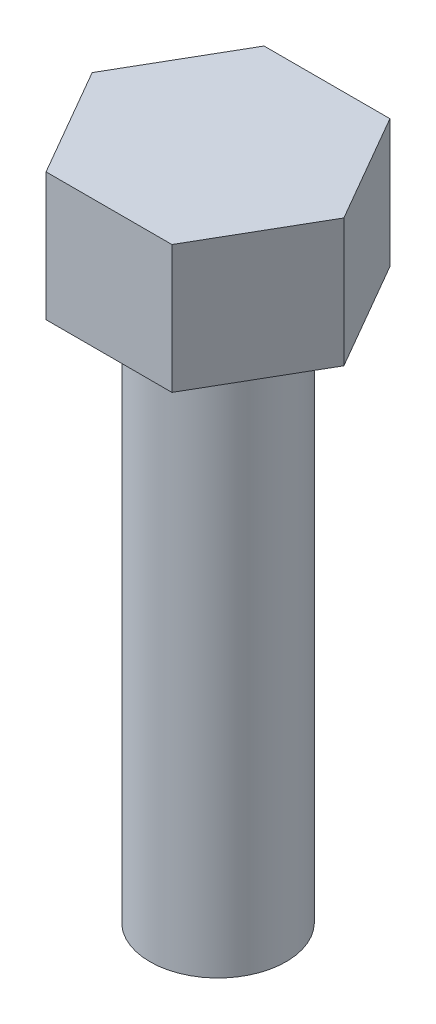
ISO-10303-21;
HEADER;
FILE_DESCRIPTION(('STEP AP214'),'2;1');
FILE_NAME('part.step','',(''),(''),'','','');
FILE_SCHEMA(('AUTOMOTIVE_DESIGN { 1 0 10303 214 1 1 1 1 }'));
ENDSEC;
DATA;
#1=APPLICATION_CONTEXT('core data for automotive mechanical design processes');
#2=APPLICATION_PROTOCOL_DEFINITION('international standard','automotive_design',2000,#1);
#3=PRODUCT_CONTEXT('',#1,'mechanical');
#4=PRODUCT('Part','Part','',(#3));
#5=PRODUCT_RELATED_PRODUCT_CATEGORY('part','',(#4));
#6=PRODUCT_DEFINITION_FORMATION('','',#4);
#7=PRODUCT_DEFINITION_CONTEXT('part definition',#1,'design');
#8=PRODUCT_DEFINITION('design','',#6,#7);
#9=PRODUCT_DEFINITION_SHAPE('','',#8);
#10=(LENGTH_UNIT() NAMED_UNIT(*) SI_UNIT(.MILLI.,.METRE.));
#11=(NAMED_UNIT(*) PLANE_ANGLE_UNIT() SI_UNIT($,.RADIAN.));
#12=(NAMED_UNIT(*) SI_UNIT($,.STERADIAN.) SOLID_ANGLE_UNIT());
#13=UNCERTAINTY_MEASURE_WITH_UNIT(LENGTH_MEASURE(1.E-05),#10,'distance_accuracy_value','');
#14=(GEOMETRIC_REPRESENTATION_CONTEXT(3) GLOBAL_UNCERTAINTY_ASSIGNED_CONTEXT((#13)) GLOBAL_UNIT_ASSIGNED_CONTEXT((#10,
#11,#12)) REPRESENTATION_CONTEXT('',''));
#15=CARTESIAN_POINT('',(0.,0.,0.));
#16=DIRECTION('',(0.,0.,1.));
#17=DIRECTION('',(1.,0.,0.));
#18=AXIS2_PLACEMENT_3D('',#15,#16,#17);
#19=CARTESIAN_POINT('',(2.30940107675853,4.7,4.00000000000007));
#20=DIRECTION('',(-0.866025403784438,0.,-0.500000000000001));
#21=DIRECTION('',(-0.500000000000001,0.,0.866025403784438));
#22=AXIS2_PLACEMENT_3D('',#19,#20,#21);
#23=PLANE('',#22);
#24=DIRECTION('',(0.500000000000001,0.,-0.866025403784438));
#25=VECTOR('',#24,1.);
#26=CARTESIAN_POINT('',(2.30940107675853,0.,4.00000000000007));
#27=LINE('',#26,#25);
#28=CARTESIAN_POINT('',(2.30940107675853,0.,4.00000000000007));
#29=VERTEX_POINT('',#28);
#30=CARTESIAN_POINT('',(4.61880215351705,0.,0.));
#31=VERTEX_POINT('',#30);
#32=EDGE_CURVE('E117',#29,#31,#27,.T.);
#33=ORIENTED_EDGE('',*,*,#32,.T.);
#34=DIRECTION('',(0.,-1.,0.));
#35=VECTOR('',#34,1.);
#36=CARTESIAN_POINT('',(4.61880215351705,4.7,0.));
#37=LINE('',#36,#35);
#38=CARTESIAN_POINT('',(4.61880215351705,4.7,0.));
#39=VERTEX_POINT('',#38);
#40=EDGE_CURVE('E11',#39,#31,#37,.T.);
#41=ORIENTED_EDGE('',*,*,#40,.F.);
#42=DIRECTION('',(0.500000000000001,0.,-0.866025403784438));
#43=VECTOR('',#42,1.);
#44=CARTESIAN_POINT('',(2.30940107675853,4.7,4.00000000000007));
#45=LINE('',#44,#43);
#46=CARTESIAN_POINT('',(2.30940107675853,4.7,4.00000000000007));
#47=VERTEX_POINT('',#46);
#48=EDGE_CURVE('E128',#47,#39,#45,.T.);
#49=ORIENTED_EDGE('',*,*,#48,.F.);
#50=DIRECTION('',(0.,-1.,0.));
#51=VECTOR('',#50,1.);
#52=CARTESIAN_POINT('',(2.30940107675853,4.7,4.00000000000007));
#53=LINE('',#52,#51);
#54=EDGE_CURVE('E113',#47,#29,#53,.T.);
#55=ORIENTED_EDGE('',*,*,#54,.T.);
#56=EDGE_LOOP('',(#33,#41,#49,#55));
#57=FACE_BOUND('',#56,.T.);
#58=ADVANCED_FACE('F33',(#57),#23,.F.);
#59=CARTESIAN_POINT('',(4.61880215351705,4.7,0.));
#60=DIRECTION('',(-0.866025403784437,0.,0.500000000000002));
#61=DIRECTION('',(0.500000000000002,0.,0.866025403784438));
#62=AXIS2_PLACEMENT_3D('',#59,#60,#61);
#63=PLANE('',#62);
#64=DIRECTION('',(-0.500000000000002,0.,-0.866025403784437));
#65=VECTOR('',#64,1.);
#66=CARTESIAN_POINT('',(4.61880215351705,0.,0.));
#67=LINE('',#66,#65);
#68=CARTESIAN_POINT('',(2.3094010767585,0.,-4.));
#69=VERTEX_POINT('',#68);
#70=EDGE_CURVE('E120',#31,#69,#67,.T.);
#71=ORIENTED_EDGE('',*,*,#70,.T.);
#72=DIRECTION('',(0.,-1.,0.));
#73=VECTOR('',#72,1.);
#74=CARTESIAN_POINT('',(2.3094010767585,4.7,-4.));
#75=LINE('',#74,#73);
#76=CARTESIAN_POINT('',(2.3094010767585,4.7,-4.));
#77=VERTEX_POINT('',#76);
#78=EDGE_CURVE('E41',#77,#69,#75,.T.);
#79=ORIENTED_EDGE('',*,*,#78,.F.);
#80=DIRECTION('',(-0.500000000000002,0.,-0.866025403784437));
#81=VECTOR('',#80,1.);
#82=CARTESIAN_POINT('',(4.61880215351705,4.7,0.));
#83=LINE('',#82,#81);
#84=EDGE_CURVE('E86',#39,#77,#83,.T.);
#85=ORIENTED_EDGE('',*,*,#84,.F.);
#86=ORIENTED_EDGE('',*,*,#40,.T.);
#87=EDGE_LOOP('',(#71,#79,#85,#86));
#88=FACE_BOUND('',#87,.T.);
#89=ADVANCED_FACE('F152',(#88),#63,.F.);
#90=CARTESIAN_POINT('',(2.3094010767585,4.7,-4.));
#91=DIRECTION('',(0.,0.,1.));
#92=DIRECTION('',(1.,0.,0.));
#93=AXIS2_PLACEMENT_3D('',#90,#91,#92);
#94=PLANE('',#93);
#95=DIRECTION('',(-1.,0.,0.));
#96=VECTOR('',#95,1.);
#97=CARTESIAN_POINT('',(2.3094010767585,0.,-4.));
#98=LINE('',#97,#96);
#99=CARTESIAN_POINT('',(-2.3094010767585,0.,-4.));
#100=VERTEX_POINT('',#99);
#101=EDGE_CURVE('E123',#69,#100,#98,.T.);
#102=ORIENTED_EDGE('',*,*,#101,.T.);
#103=DIRECTION('',(0.,-1.,0.));
#104=VECTOR('',#103,1.);
#105=CARTESIAN_POINT('',(-2.3094010767585,4.7,-4.));
#106=LINE('',#105,#104);
#107=CARTESIAN_POINT('',(-2.3094010767585,4.7,-4.));
#108=VERTEX_POINT('',#107);
#109=EDGE_CURVE('E108',#108,#100,#106,.T.);
#110=ORIENTED_EDGE('',*,*,#109,.F.);
#111=DIRECTION('',(-1.,0.,0.));
#112=VECTOR('',#111,1.);
#113=CARTESIAN_POINT('',(2.3094010767585,4.7,-4.));
#114=LINE('',#113,#112);
#115=EDGE_CURVE('E99',#77,#108,#114,.T.);
#116=ORIENTED_EDGE('',*,*,#115,.F.);
#117=ORIENTED_EDGE('',*,*,#78,.T.);
#118=EDGE_LOOP('',(#102,#110,#116,#117));
#119=FACE_BOUND('',#118,.T.);
#120=ADVANCED_FACE('F134',(#119),#94,.F.);
#121=CARTESIAN_POINT('',(-2.3094010767585,4.7,-4.));
#122=DIRECTION('',(0.866025403784439,0.,0.5));
#123=DIRECTION('',(0.5,0.,-0.866025403784439));
#124=AXIS2_PLACEMENT_3D('',#121,#122,#123);
#125=PLANE('',#124);
#126=DIRECTION('',(-0.5,0.,0.866025403784438));
#127=VECTOR('',#126,1.);
#128=CARTESIAN_POINT('',(-2.3094010767585,0.,-4.));
#129=LINE('',#128,#127);
#130=CARTESIAN_POINT('',(-4.61880215351701,0.,0.));
#131=VERTEX_POINT('',#130);
#132=EDGE_CURVE('E107',#100,#131,#129,.T.);
#133=ORIENTED_EDGE('',*,*,#132,.T.);
#134=DIRECTION('',(0.,-1.,0.));
#135=VECTOR('',#134,1.);
#136=CARTESIAN_POINT('',(-4.61880215351701,4.7,0.));
#137=LINE('',#136,#135);
#138=CARTESIAN_POINT('',(-4.61880215351701,4.7,0.));
#139=VERTEX_POINT('',#138);
#140=EDGE_CURVE('E104',#139,#131,#137,.T.);
#141=ORIENTED_EDGE('',*,*,#140,.F.);
#142=DIRECTION('',(-0.5,0.,0.866025403784438));
#143=VECTOR('',#142,1.);
#144=CARTESIAN_POINT('',(-2.3094010767585,4.7,-4.));
#145=LINE('',#144,#143);
#146=EDGE_CURVE('E93',#108,#139,#145,.T.);
#147=ORIENTED_EDGE('',*,*,#146,.F.);
#148=ORIENTED_EDGE('',*,*,#109,.T.);
#149=EDGE_LOOP('',(#133,#141,#147,#148));
#150=FACE_BOUND('',#149,.T.);
#151=ADVANCED_FACE('F105',(#150),#125,.F.);
#152=CARTESIAN_POINT('',(-4.61880215351701,4.7,0.));
#153=DIRECTION('',(0.866025403784447,0.,-0.499999999999985));
#154=DIRECTION('',(-0.499999999999985,0.,-0.866025403784447));
#155=AXIS2_PLACEMENT_3D('',#152,#153,#154);
#156=PLANE('',#155);
#157=DIRECTION('',(0.499999999999985,0.,0.866025403784447));
#158=VECTOR('',#157,1.);
#159=CARTESIAN_POINT('',(-4.61880215351701,0.,0.));
#160=LINE('',#159,#158);
#161=CARTESIAN_POINT('',(-2.30940107675855,0.,4.00000000000007));
#162=VERTEX_POINT('',#161);
#163=EDGE_CURVE('E72',#131,#162,#160,.T.);
#164=ORIENTED_EDGE('',*,*,#163,.T.);
#165=DIRECTION('',(0.,-1.,0.));
#166=VECTOR('',#165,1.);
#167=CARTESIAN_POINT('',(-2.30940107675855,4.7,4.00000000000007));
#168=LINE('',#167,#166);
#169=CARTESIAN_POINT('',(-2.30940107675855,4.7,4.00000000000007));
#170=VERTEX_POINT('',#169);
#171=EDGE_CURVE('E109',#170,#162,#168,.T.);
#172=ORIENTED_EDGE('',*,*,#171,.F.);
#173=DIRECTION('',(0.499999999999985,0.,0.866025403784447));
#174=VECTOR('',#173,1.);
#175=CARTESIAN_POINT('',(-4.61880215351701,4.7,0.));
#176=LINE('',#175,#174);
#177=EDGE_CURVE('E97',#139,#170,#176,.T.);
#178=ORIENTED_EDGE('',*,*,#177,.F.);
#179=ORIENTED_EDGE('',*,*,#140,.T.);
#180=EDGE_LOOP('',(#164,#172,#178,#179));
#181=FACE_BOUND('',#180,.T.);
#182=ADVANCED_FACE('F111',(#181),#156,.F.);
#183=CARTESIAN_POINT('',(-2.30940107675855,4.7,4.00000000000007));
#184=DIRECTION('',(0.,0.,-1.));
#185=DIRECTION('',(-1.,0.,0.));
#186=AXIS2_PLACEMENT_3D('',#183,#184,#185);
#187=PLANE('',#186);
#188=DIRECTION('',(1.,0.,0.));
#189=VECTOR('',#188,1.);
#190=CARTESIAN_POINT('',(-2.30940107675855,0.,4.00000000000007));
#191=LINE('',#190,#189);
#192=EDGE_CURVE('E78',#162,#29,#191,.T.);
#193=ORIENTED_EDGE('',*,*,#192,.T.);
#194=ORIENTED_EDGE('',*,*,#54,.F.);
#195=DIRECTION('',(1.,0.,0.));
#196=VECTOR('',#195,1.);
#197=CARTESIAN_POINT('',(-2.30940107675855,4.7,4.00000000000007));
#198=LINE('',#197,#196);
#199=EDGE_CURVE('E49',#170,#47,#198,.T.);
#200=ORIENTED_EDGE('',*,*,#199,.F.);
#201=ORIENTED_EDGE('',*,*,#171,.T.);
#202=EDGE_LOOP('',(#193,#194,#200,#201));
#203=FACE_BOUND('',#202,.T.);
#204=ADVANCED_FACE('F141',(#203),#187,.F.);
#205=CARTESIAN_POINT('',(4.61880215351705,4.7,0.));
#206=DIRECTION('',(0.,1.,0.));
#207=DIRECTION('',(0.,0.,1.));
#208=AXIS2_PLACEMENT_3D('',#205,#206,#207);
#209=PLANE('',#208);
#210=ORIENTED_EDGE('',*,*,#48,.T.);
#211=ORIENTED_EDGE('',*,*,#84,.T.);
#212=ORIENTED_EDGE('',*,*,#115,.T.);
#213=ORIENTED_EDGE('',*,*,#146,.T.);
#214=ORIENTED_EDGE('',*,*,#177,.T.);
#215=ORIENTED_EDGE('',*,*,#199,.T.);
#216=EDGE_LOOP('',(#210,#211,#212,#213,#214,#215));
#217=FACE_BOUND('',#216,.T.);
#218=ADVANCED_FACE('F95',(#217),#209,.T.);
#219=CARTESIAN_POINT('',(4.61880215351705,0.,0.));
#220=DIRECTION('',(0.,1.,0.));
#221=DIRECTION('',(0.,0.,1.));
#222=AXIS2_PLACEMENT_3D('',#219,#220,#221);
#223=PLANE('',#222);
#224=CARTESIAN_POINT('',(0.,0.,0.));
#225=DIRECTION('',(0.,1.,0.));
#226=DIRECTION('',(0.,0.,1.));
#227=AXIS2_PLACEMENT_3D('',#224,#225,#226);
#228=CIRCLE('',#227,2.5);
#229=CARTESIAN_POINT('',(0.,0.,2.5));
#230=VERTEX_POINT('',#229);
#231=EDGE_CURVE('E214',#230,#230,#228,.T.);
#232=ORIENTED_EDGE('',*,*,#231,.T.);
#233=EDGE_LOOP('',(#232));
#234=FACE_BOUND('',#233,.T.);
#235=ORIENTED_EDGE('',*,*,#32,.F.);
#236=ORIENTED_EDGE('',*,*,#192,.F.);
#237=ORIENTED_EDGE('',*,*,#163,.F.);
#238=ORIENTED_EDGE('',*,*,#132,.F.);
#239=ORIENTED_EDGE('',*,*,#101,.F.);
#240=ORIENTED_EDGE('',*,*,#70,.F.);
#241=EDGE_LOOP('',(#235,#236,#237,#238,#239,#240));
#242=FACE_BOUND('',#241,.T.);
#243=ADVANCED_FACE('F137',(#234,#242),#223,.F.);
#244=CARTESIAN_POINT('',(0.,-20.,0.));
#245=DIRECTION('',(0.,1.,0.));
#246=DIRECTION('',(0.,0.,1.));
#247=AXIS2_PLACEMENT_3D('',#244,#245,#246);
#248=CYLINDRICAL_SURFACE('',#247,2.5);
#249=CARTESIAN_POINT('',(0.,-20.,0.));
#250=DIRECTION('',(0.,1.,0.));
#251=DIRECTION('',(0.,0.,1.));
#252=AXIS2_PLACEMENT_3D('',#249,#250,#251);
#253=CIRCLE('',#252,2.5);
#254=CARTESIAN_POINT('',(0.,-20.,2.5));
#255=VERTEX_POINT('',#254);
#256=EDGE_CURVE('E121',#255,#255,#253,.T.);
#257=ORIENTED_EDGE('',*,*,#256,.T.);
#258=EDGE_LOOP('',(#257));
#259=FACE_BOUND('',#258,.T.);
#260=ORIENTED_EDGE('',*,*,#231,.F.);
#261=EDGE_LOOP('',(#260));
#262=FACE_BOUND('',#261,.T.);
#263=ADVANCED_FACE('F189',(#259,#262),#248,.T.);
#264=CARTESIAN_POINT('',(0.,-20.,0.));
#265=DIRECTION('',(0.,1.,0.));
#266=DIRECTION('',(0.,0.,1.));
#267=AXIS2_PLACEMENT_3D('',#264,#265,#266);
#268=PLANE('',#267);
#269=ORIENTED_EDGE('',*,*,#256,.F.);
#270=EDGE_LOOP('',(#269));
#271=FACE_BOUND('',#270,.T.);
#272=ADVANCED_FACE('F198',(#271),#268,.F.);
#273=CLOSED_SHELL('',(#58,#89,#120,#151,#182,#204,#218,#243,#263,#272));
#274=MANIFOLD_SOLID_BREP('B2',#273);
#275=ADVANCED_BREP_SHAPE_REPRESENTATION('',(#18,#274),#14);
#276=SHAPE_DEFINITION_REPRESENTATION(#9,#275);
ENDSEC;
END-ISO-10303-21;
